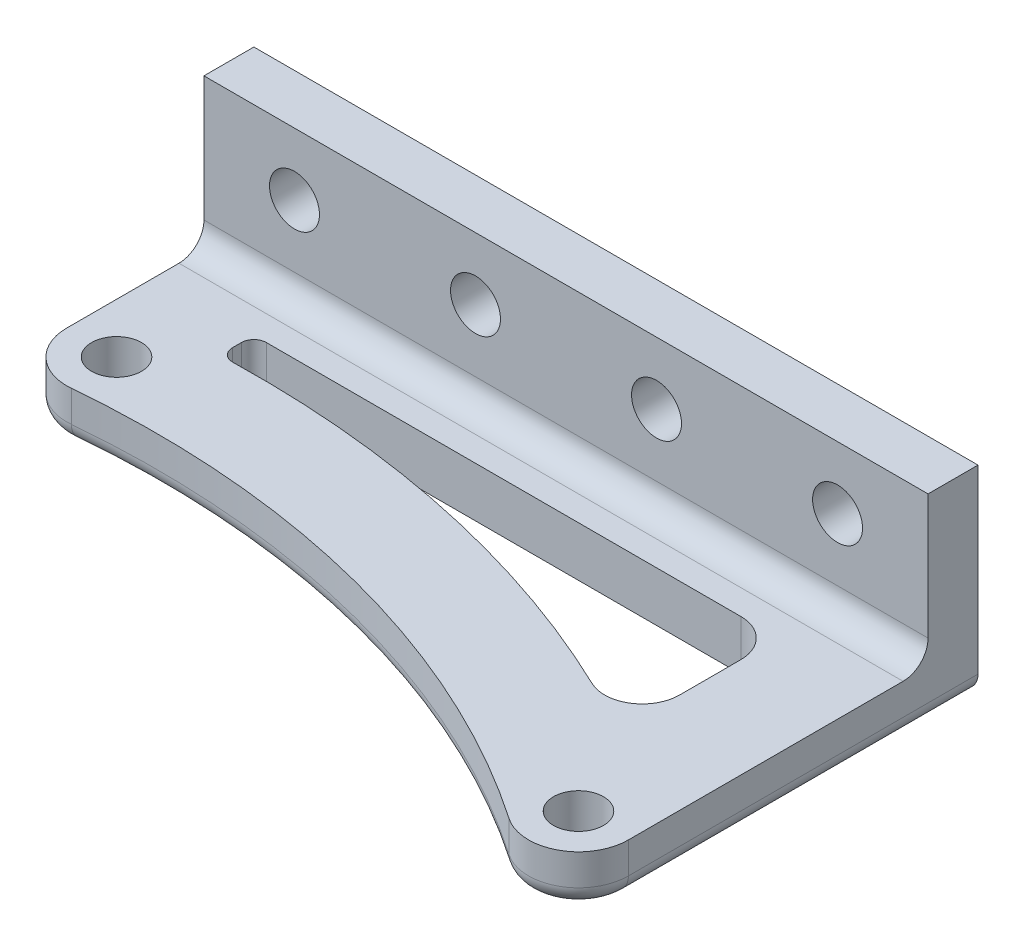
ISO-10303-21;
HEADER;
FILE_DESCRIPTION(('STEP AP214'),'2;1');
FILE_NAME('part.step','',(''),(''),'','','');
FILE_SCHEMA(('AUTOMOTIVE_DESIGN { 1 0 10303 214 1 1 1 1 }'));
ENDSEC;
DATA;
#1=APPLICATION_CONTEXT('core data for automotive mechanical design processes');
#2=APPLICATION_PROTOCOL_DEFINITION('international standard','automotive_design',2000,#1);
#3=PRODUCT_CONTEXT('',#1,'mechanical');
#4=PRODUCT('Part','Part','',(#3));
#5=PRODUCT_RELATED_PRODUCT_CATEGORY('part','',(#4));
#6=PRODUCT_DEFINITION_FORMATION('','',#4);
#7=PRODUCT_DEFINITION_CONTEXT('part definition',#1,'design');
#8=PRODUCT_DEFINITION('design','',#6,#7);
#9=PRODUCT_DEFINITION_SHAPE('','',#8);
#10=(LENGTH_UNIT() NAMED_UNIT(*) SI_UNIT(.MILLI.,.METRE.));
#11=(NAMED_UNIT(*) PLANE_ANGLE_UNIT() SI_UNIT($,.RADIAN.));
#12=(NAMED_UNIT(*) SI_UNIT($,.STERADIAN.) SOLID_ANGLE_UNIT());
#13=UNCERTAINTY_MEASURE_WITH_UNIT(LENGTH_MEASURE(1.E-05),#10,'distance_accuracy_value','');
#14=(GEOMETRIC_REPRESENTATION_CONTEXT(3) GLOBAL_UNCERTAINTY_ASSIGNED_CONTEXT((#13)) GLOBAL_UNIT_ASSIGNED_CONTEXT((#10,
#11,#12)) REPRESENTATION_CONTEXT('',''));
#15=CARTESIAN_POINT('',(0.,0.,0.));
#16=DIRECTION('',(0.,0.,1.));
#17=DIRECTION('',(1.,0.,0.));
#18=AXIS2_PLACEMENT_3D('',#15,#16,#17);
#19=CARTESIAN_POINT('',(-4.,4.,-28.));
#20=DIRECTION('',(0.,0.,1.));
#21=DIRECTION('',(1.,0.,0.));
#22=AXIS2_PLACEMENT_3D('',#19,#20,#21);
#23=PLANE('',#22);
#24=CARTESIAN_POINT('',(3.25,11.,-28.));
#25=DIRECTION('',(0.,0.,1.));
#26=DIRECTION('',(1.,0.,0.));
#27=AXIS2_PLACEMENT_3D('',#24,#25,#26);
#28=CIRCLE('',#27,2.);
#29=CARTESIAN_POINT('',(5.25,11.,-28.));
#30=VERTEX_POINT('',#29);
#31=EDGE_CURVE('E584',#30,#30,#28,.F.);
#32=ORIENTED_EDGE('',*,*,#31,.F.);
#33=EDGE_LOOP('',(#32));
#34=FACE_BOUND('',#33,.T.);
#35=CARTESIAN_POINT('',(17.75,11.,-28.));
#36=DIRECTION('',(0.,0.,1.));
#37=DIRECTION('',(1.,0.,0.));
#38=AXIS2_PLACEMENT_3D('',#35,#36,#37);
#39=CIRCLE('',#38,2.);
#40=CARTESIAN_POINT('',(19.75,11.,-28.));
#41=VERTEX_POINT('',#40);
#42=EDGE_CURVE('E203',#41,#41,#39,.F.);
#43=ORIENTED_EDGE('',*,*,#42,.F.);
#44=EDGE_LOOP('',(#43));
#45=FACE_BOUND('',#44,.T.);
#46=DIRECTION('',(0.,-1.,0.));
#47=VECTOR('',#46,1.);
#48=CARTESIAN_POINT('',(54.,4.,-28.));
#49=LINE('',#48,#47);
#50=CARTESIAN_POINT('',(54.,16.,-28.));
#51=VERTEX_POINT('',#50);
#52=CARTESIAN_POINT('',(54.,1.5,-28.));
#53=VERTEX_POINT('',#52);
#54=EDGE_CURVE('E185',#51,#53,#49,.T.);
#55=ORIENTED_EDGE('',*,*,#54,.T.);
#56=CARTESIAN_POINT('',(52.5,1.5,-28.));
#57=DIRECTION('',(0.,0.,1.));
#58=DIRECTION('',(1.,0.,0.));
#59=AXIS2_PLACEMENT_3D('',#56,#57,#58);
#60=CIRCLE('',#59,1.5);
#61=CARTESIAN_POINT('',(52.5,0.,-28.));
#62=VERTEX_POINT('',#61);
#63=EDGE_CURVE('E398',#53,#62,#60,.F.);
#64=ORIENTED_EDGE('',*,*,#63,.T.);
#65=DIRECTION('',(-1.,0.,0.));
#66=VECTOR('',#65,1.);
#67=CARTESIAN_POINT('',(-4.,0.,-28.));
#68=LINE('',#67,#66);
#69=CARTESIAN_POINT('',(-2.5,0.,-28.));
#70=VERTEX_POINT('',#69);
#71=EDGE_CURVE('E321',#62,#70,#68,.T.);
#72=ORIENTED_EDGE('',*,*,#71,.T.);
#73=CARTESIAN_POINT('',(-2.5,1.5,-28.));
#74=DIRECTION('',(0.,0.,1.));
#75=DIRECTION('',(1.,0.,0.));
#76=AXIS2_PLACEMENT_3D('',#73,#74,#75);
#77=CIRCLE('',#76,1.5);
#78=CARTESIAN_POINT('',(-4.,1.5,-28.));
#79=VERTEX_POINT('',#78);
#80=EDGE_CURVE('E182',#70,#79,#77,.F.);
#81=ORIENTED_EDGE('',*,*,#80,.T.);
#82=DIRECTION('',(0.,-1.,0.));
#83=VECTOR('',#82,1.);
#84=CARTESIAN_POINT('',(-4.,4.,-28.));
#85=LINE('',#84,#83);
#86=CARTESIAN_POINT('',(-4.,16.,-28.));
#87=VERTEX_POINT('',#86);
#88=EDGE_CURVE('E175',#87,#79,#85,.T.);
#89=ORIENTED_EDGE('',*,*,#88,.F.);
#90=DIRECTION('',(-1.,0.,0.));
#91=VECTOR('',#90,1.);
#92=CARTESIAN_POINT('',(54.,16.,-28.));
#93=LINE('',#92,#91);
#94=EDGE_CURVE('E180',#51,#87,#93,.T.);
#95=ORIENTED_EDGE('',*,*,#94,.F.);
#96=EDGE_LOOP('',(#55,#64,#72,#81,#89,#95));
#97=FACE_BOUND('',#96,.T.);
#98=CARTESIAN_POINT('',(32.25,11.,-28.));
#99=DIRECTION('',(0.,0.,1.));
#100=DIRECTION('',(1.,0.,0.));
#101=AXIS2_PLACEMENT_3D('',#98,#99,#100);
#102=CIRCLE('',#101,2.);
#103=CARTESIAN_POINT('',(34.25,11.,-28.));
#104=VERTEX_POINT('',#103);
#105=EDGE_CURVE('E564',#104,#104,#102,.T.);
#106=ORIENTED_EDGE('',*,*,#105,.T.);
#107=EDGE_LOOP('',(#106));
#108=FACE_BOUND('',#107,.T.);
#109=CARTESIAN_POINT('',(46.75,11.,-28.));
#110=DIRECTION('',(0.,0.,1.));
#111=DIRECTION('',(1.,0.,0.));
#112=AXIS2_PLACEMENT_3D('',#109,#110,#111);
#113=CIRCLE('',#112,2.);
#114=CARTESIAN_POINT('',(48.75,11.,-28.));
#115=VERTEX_POINT('',#114);
#116=EDGE_CURVE('E576',#115,#115,#113,.T.);
#117=ORIENTED_EDGE('',*,*,#116,.T.);
#118=EDGE_LOOP('',(#117));
#119=FACE_BOUND('',#118,.T.);
#120=ADVANCED_FACE('F38',(#34,#45,#97,#108,#119),#23,.F.);
#121=CARTESIAN_POINT('',(-4.,16.,-24.));
#122=DIRECTION('',(0.,0.,-1.));
#123=DIRECTION('',(-1.,0.,0.));
#124=AXIS2_PLACEMENT_3D('',#121,#122,#123);
#125=PLANE('',#124);
#126=CARTESIAN_POINT('',(3.25,11.,-24.));
#127=DIRECTION('',(0.,0.,1.));
#128=DIRECTION('',(1.,0.,0.));
#129=AXIS2_PLACEMENT_3D('',#126,#127,#128);
#130=CIRCLE('',#129,2.);
#131=CARTESIAN_POINT('',(5.25,11.,-24.));
#132=VERTEX_POINT('',#131);
#133=EDGE_CURVE('E580',#132,#132,#130,.T.);
#134=ORIENTED_EDGE('',*,*,#133,.F.);
#135=EDGE_LOOP('',(#134));
#136=FACE_BOUND('',#135,.T.);
#137=CARTESIAN_POINT('',(17.75,11.,-24.));
#138=DIRECTION('',(0.,0.,1.));
#139=DIRECTION('',(1.,0.,0.));
#140=AXIS2_PLACEMENT_3D('',#137,#138,#139);
#141=CIRCLE('',#140,2.);
#142=CARTESIAN_POINT('',(19.75,11.,-24.));
#143=VERTEX_POINT('',#142);
#144=EDGE_CURVE('E207',#143,#143,#141,.T.);
#145=ORIENTED_EDGE('',*,*,#144,.F.);
#146=EDGE_LOOP('',(#145));
#147=FACE_BOUND('',#146,.T.);
#148=DIRECTION('',(0.,-1.,0.));
#149=VECTOR('',#148,1.);
#150=CARTESIAN_POINT('',(-4.,16.,-24.));
#151=LINE('',#150,#149);
#152=CARTESIAN_POINT('',(-4.,16.,-24.));
#153=VERTEX_POINT('',#152);
#154=CARTESIAN_POINT('',(-4.,6.,-24.));
#155=VERTEX_POINT('',#154);
#156=EDGE_CURVE('E192',#153,#155,#151,.T.);
#157=ORIENTED_EDGE('',*,*,#156,.T.);
#158=DIRECTION('',(1.,0.,0.));
#159=VECTOR('',#158,1.);
#160=CARTESIAN_POINT('',(-4.,6.,-24.));
#161=LINE('',#160,#159);
#162=CARTESIAN_POINT('',(54.,6.,-24.));
#163=VERTEX_POINT('',#162);
#164=EDGE_CURVE('E358',#155,#163,#161,.T.);
#165=ORIENTED_EDGE('',*,*,#164,.T.);
#166=DIRECTION('',(0.,-1.,0.));
#167=VECTOR('',#166,1.);
#168=CARTESIAN_POINT('',(54.,16.,-24.));
#169=LINE('',#168,#167);
#170=CARTESIAN_POINT('',(54.,16.,-24.));
#171=VERTEX_POINT('',#170);
#172=EDGE_CURVE('E215',#171,#163,#169,.T.);
#173=ORIENTED_EDGE('',*,*,#172,.F.);
#174=DIRECTION('',(1.,0.,0.));
#175=VECTOR('',#174,1.);
#176=CARTESIAN_POINT('',(-4.,16.,-24.));
#177=LINE('',#176,#175);
#178=EDGE_CURVE('E196',#153,#171,#177,.T.);
#179=ORIENTED_EDGE('',*,*,#178,.F.);
#180=EDGE_LOOP('',(#157,#165,#173,#179));
#181=FACE_BOUND('',#180,.T.);
#182=CARTESIAN_POINT('',(32.25,11.,-24.));
#183=DIRECTION('',(0.,0.,1.));
#184=DIRECTION('',(1.,0.,0.));
#185=AXIS2_PLACEMENT_3D('',#182,#183,#184);
#186=CIRCLE('',#185,2.);
#187=CARTESIAN_POINT('',(34.25,11.,-24.));
#188=VERTEX_POINT('',#187);
#189=EDGE_CURVE('E567',#188,#188,#186,.F.);
#190=ORIENTED_EDGE('',*,*,#189,.T.);
#191=EDGE_LOOP('',(#190));
#192=FACE_BOUND('',#191,.T.);
#193=CARTESIAN_POINT('',(46.75,11.,-24.));
#194=DIRECTION('',(0.,0.,1.));
#195=DIRECTION('',(1.,0.,0.));
#196=AXIS2_PLACEMENT_3D('',#193,#194,#195);
#197=CIRCLE('',#196,2.);
#198=CARTESIAN_POINT('',(48.75,11.,-24.));
#199=VERTEX_POINT('',#198);
#200=EDGE_CURVE('E573',#199,#199,#197,.F.);
#201=ORIENTED_EDGE('',*,*,#200,.T.);
#202=EDGE_LOOP('',(#201));
#203=FACE_BOUND('',#202,.T.);
#204=ADVANCED_FACE('F458',(#136,#147,#181,#192,#203),#125,.F.);
#205=CARTESIAN_POINT('',(0.,1.5,-13.));
#206=DIRECTION('',(0.,1.,0.));
#207=DIRECTION('',(0.,0.,1.));
#208=AXIS2_PLACEMENT_3D('',#205,#206,#207);
#209=TOROIDAL_SURFACE('',#208,2.5,1.5);
#210=CARTESIAN_POINT('',(-2.5,1.5,-13.));
#211=DIRECTION('',(0.,0.,-1.));
#212=DIRECTION('',(-1.,0.,0.));
#213=AXIS2_PLACEMENT_3D('',#210,#211,#212);
#214=CIRCLE('',#213,1.5);
#215=CARTESIAN_POINT('',(-2.5,0.,-13.));
#216=VERTEX_POINT('',#215);
#217=CARTESIAN_POINT('',(-4.,1.5,-13.));
#218=VERTEX_POINT('',#217);
#219=EDGE_CURVE('E11',#216,#218,#214,.T.);
#220=ORIENTED_EDGE('',*,*,#219,.F.);
#221=CARTESIAN_POINT('',(0.,0.,-13.));
#222=DIRECTION('',(0.,1.,0.));
#223=DIRECTION('',(0.,0.,1.));
#224=AXIS2_PLACEMENT_3D('',#221,#222,#223);
#225=CIRCLE('',#224,2.5);
#226=CARTESIAN_POINT('',(0.225630994390622,0.,-10.5102026880948));
#227=VERTEX_POINT('',#226);
#228=EDGE_CURVE('E376',#227,#216,#225,.F.);
#229=ORIENTED_EDGE('',*,*,#228,.F.);
#230=CARTESIAN_POINT('',(0.225630994390629,1.5,-10.5102026880948));
#231=DIRECTION('',(-0.995918924762076,0.,0.090252397756244));
#232=DIRECTION('',(0.090252397756244,0.,0.995918924762076));
#233=AXIS2_PLACEMENT_3D('',#230,#231,#232);
#234=CIRCLE('',#233,1.5);
#235=CARTESIAN_POINT('',(0.361009591024995,1.5,-9.0163243009517));
#236=VERTEX_POINT('',#235);
#237=EDGE_CURVE('E47',#227,#236,#234,.T.);
#238=ORIENTED_EDGE('',*,*,#237,.T.);
#239=CARTESIAN_POINT('',(0.,1.5,-13.));
#240=DIRECTION('',(0.,1.,0.));
#241=DIRECTION('',(0.,0.,1.));
#242=AXIS2_PLACEMENT_3D('',#239,#240,#241);
#243=CIRCLE('',#242,4.);
#244=EDGE_CURVE('E409',#218,#236,#243,.T.);
#245=ORIENTED_EDGE('',*,*,#244,.F.);
#246=EDGE_LOOP('',(#220,#229,#238,#245));
#247=FACE_BOUND('',#246,.T.);
#248=ADVANCED_FACE('F447',(#247),#209,.T.);
#249=CARTESIAN_POINT('',(6.89832871152092,1.5,63.1218126479964));
#250=DIRECTION('',(0.,1.,0.));
#251=DIRECTION('',(0.,0.,1.));
#252=AXIS2_PLACEMENT_3D('',#249,#250,#251);
#253=TOROIDAL_SURFACE('',#252,73.9337445100583,1.5);
#254=ORIENTED_EDGE('',*,*,#237,.F.);
#255=CARTESIAN_POINT('',(6.89832871152092,0.,63.1218126479964));
#256=DIRECTION('',(0.,1.,0.));
#257=DIRECTION('',(0.,0.,1.));
#258=AXIS2_PLACEMENT_3D('',#255,#256,#257);
#259=CIRCLE('',#258,73.9337445100583);
#260=CARTESIAN_POINT('',(48.5902276682648,0.,2.06459244711248));
#261=VERTEX_POINT('',#260);
#262=EDGE_CURVE('E380',#261,#227,#259,.T.);
#263=ORIENTED_EDGE('',*,*,#262,.F.);
#264=CARTESIAN_POINT('',(48.5902276682648,1.5,2.06459244711248));
#265=DIRECTION('',(-0.825836978844991,0.,-0.563908932694082));
#266=DIRECTION('',(-0.563908932694082,0.,0.825836978844991));
#267=AXIS2_PLACEMENT_3D('',#264,#265,#266);
#268=CIRCLE('',#267,1.5);
#269=CARTESIAN_POINT('',(47.7443642692237,1.5,3.30334791537996));
#270=VERTEX_POINT('',#269);
#271=EDGE_CURVE('E418',#261,#270,#268,.T.);
#272=ORIENTED_EDGE('',*,*,#271,.T.);
#273=CARTESIAN_POINT('',(6.89832871152092,1.5,63.1218126479964));
#274=DIRECTION('',(0.,1.,0.));
#275=DIRECTION('',(0.,0.,1.));
#276=AXIS2_PLACEMENT_3D('',#273,#274,#275);
#277=CIRCLE('',#276,72.4337445100582);
#278=EDGE_CURVE('E405',#236,#270,#277,.F.);
#279=ORIENTED_EDGE('',*,*,#278,.F.);
#280=EDGE_LOOP('',(#254,#263,#272,#279));
#281=FACE_BOUND('',#280,.T.);
#282=ADVANCED_FACE('F424',(#281),#253,.T.);
#283=CARTESIAN_POINT('',(50.,1.5,0.));
#284=DIRECTION('',(0.,1.,0.));
#285=DIRECTION('',(0.,0.,1.));
#286=AXIS2_PLACEMENT_3D('',#283,#284,#285);
#287=TOROIDAL_SURFACE('',#286,2.50000000000001,1.5);
#288=ORIENTED_EDGE('',*,*,#271,.F.);
#289=CARTESIAN_POINT('',(50.,0.,0.));
#290=DIRECTION('',(0.,1.,0.));
#291=DIRECTION('',(0.,0.,1.));
#292=AXIS2_PLACEMENT_3D('',#289,#290,#291);
#293=CIRCLE('',#292,2.50000000000001);
#294=CARTESIAN_POINT('',(52.5,0.,0.));
#295=VERTEX_POINT('',#294);
#296=EDGE_CURVE('E384',#295,#261,#293,.F.);
#297=ORIENTED_EDGE('',*,*,#296,.F.);
#298=CARTESIAN_POINT('',(52.5,1.5,0.));
#299=DIRECTION('',(0.,0.,1.));
#300=DIRECTION('',(1.,0.,0.));
#301=AXIS2_PLACEMENT_3D('',#298,#299,#300);
#302=CIRCLE('',#301,1.5);
#303=CARTESIAN_POINT('',(54.,1.5,0.));
#304=VERTEX_POINT('',#303);
#305=EDGE_CURVE('E415',#295,#304,#302,.T.);
#306=ORIENTED_EDGE('',*,*,#305,.T.);
#307=CARTESIAN_POINT('',(50.,1.5,0.));
#308=DIRECTION('',(0.,1.,0.));
#309=DIRECTION('',(0.,0.,1.));
#310=AXIS2_PLACEMENT_3D('',#307,#308,#309);
#311=CIRCLE('',#310,4.00000000000001);
#312=EDGE_CURVE('E401',#270,#304,#311,.T.);
#313=ORIENTED_EDGE('',*,*,#312,.F.);
#314=EDGE_LOOP('',(#288,#297,#306,#313));
#315=FACE_BOUND('',#314,.T.);
#316=ADVANCED_FACE('F433',(#315),#287,.T.);
#317=CARTESIAN_POINT('',(52.5,1.5,-13.));
#318=DIRECTION('',(0.,0.,1.));
#319=DIRECTION('',(1.,0.,0.));
#320=AXIS2_PLACEMENT_3D('',#317,#318,#319);
#321=CYLINDRICAL_SURFACE('',#320,1.5);
#322=ORIENTED_EDGE('',*,*,#305,.F.);
#323=DIRECTION('',(0.,0.,1.));
#324=VECTOR('',#323,1.);
#325=CARTESIAN_POINT('',(52.5,0.,-13.));
#326=LINE('',#325,#324);
#327=EDGE_CURVE('E388',#62,#295,#326,.T.);
#328=ORIENTED_EDGE('',*,*,#327,.F.);
#329=ORIENTED_EDGE('',*,*,#63,.F.);
#330=DIRECTION('',(0.,0.,1.));
#331=VECTOR('',#330,1.);
#332=CARTESIAN_POINT('',(54.,1.5,-28.));
#333=LINE('',#332,#331);
#334=EDGE_CURVE('E392',#304,#53,#333,.F.);
#335=ORIENTED_EDGE('',*,*,#334,.F.);
#336=EDGE_LOOP('',(#322,#328,#329,#335));
#337=FACE_BOUND('',#336,.T.);
#338=ADVANCED_FACE('F464',(#337),#321,.T.);
#339=CARTESIAN_POINT('',(-2.5,1.5,-13.));
#340=DIRECTION('',(0.,0.,-1.));
#341=DIRECTION('',(-1.,0.,0.));
#342=AXIS2_PLACEMENT_3D('',#339,#340,#341);
#343=CYLINDRICAL_SURFACE('',#342,1.5);
#344=DIRECTION('',(0.,0.,-1.));
#345=VECTOR('',#344,1.);
#346=CARTESIAN_POINT('',(-2.5,0.,-13.));
#347=LINE('',#346,#345);
#348=EDGE_CURVE('E372',#216,#70,#347,.T.);
#349=ORIENTED_EDGE('',*,*,#348,.F.);
#350=ORIENTED_EDGE('',*,*,#219,.T.);
#351=DIRECTION('',(0.,0.,-1.));
#352=VECTOR('',#351,1.);
#353=CARTESIAN_POINT('',(-4.,1.5,-13.));
#354=LINE('',#353,#352);
#355=EDGE_CURVE('E412',#79,#218,#354,.F.);
#356=ORIENTED_EDGE('',*,*,#355,.F.);
#357=ORIENTED_EDGE('',*,*,#80,.F.);
#358=EDGE_LOOP('',(#349,#350,#356,#357));
#359=FACE_BOUND('',#358,.T.);
#360=ADVANCED_FACE('F40',(#359),#343,.T.);
#361=CARTESIAN_POINT('',(-4.,6.,-22.));
#362=DIRECTION('',(1.,0.,0.));
#363=DIRECTION('',(0.,0.,-1.));
#364=AXIS2_PLACEMENT_3D('',#361,#362,#363);
#365=CYLINDRICAL_SURFACE('',#364,2.);
#366=ORIENTED_EDGE('',*,*,#164,.F.);
#367=CARTESIAN_POINT('',(-4.,6.,-22.));
#368=DIRECTION('',(1.,0.,0.));
#369=DIRECTION('',(0.,0.,-1.));
#370=AXIS2_PLACEMENT_3D('',#367,#368,#369);
#371=CIRCLE('',#370,2.);
#372=CARTESIAN_POINT('',(-4.,4.,-22.));
#373=VERTEX_POINT('',#372);
#374=EDGE_CURVE('E366',#155,#373,#371,.F.);
#375=ORIENTED_EDGE('',*,*,#374,.T.);
#376=DIRECTION('',(1.,0.,0.));
#377=VECTOR('',#376,1.);
#378=CARTESIAN_POINT('',(0.,4.,-22.));
#379=LINE('',#378,#377);
#380=CARTESIAN_POINT('',(54.,4.,-22.));
#381=VERTEX_POINT('',#380);
#382=EDGE_CURVE('E362',#381,#373,#379,.F.);
#383=ORIENTED_EDGE('',*,*,#382,.F.);
#384=CARTESIAN_POINT('',(54.,6.,-22.));
#385=DIRECTION('',(-1.,0.,0.));
#386=DIRECTION('',(0.,0.,1.));
#387=AXIS2_PLACEMENT_3D('',#384,#385,#386);
#388=CIRCLE('',#387,2.);
#389=EDGE_CURVE('E369',#381,#163,#388,.F.);
#390=ORIENTED_EDGE('',*,*,#389,.T.);
#391=EDGE_LOOP('',(#366,#375,#383,#390));
#392=FACE_BOUND('',#391,.T.);
#393=ADVANCED_FACE('F455',(#392),#365,.F.);
#394=CARTESIAN_POINT('',(0.,4.,-13.));
#395=DIRECTION('',(0.,1.,0.));
#396=DIRECTION('',(0.,0.,1.));
#397=AXIS2_PLACEMENT_3D('',#394,#395,#396);
#398=PLANE('',#397);
#399=DIRECTION('',(0.,0.,-1.));
#400=VECTOR('',#399,1.);
#401=CARTESIAN_POINT('',(54.,4.,-28.));
#402=LINE('',#401,#400);
#403=CARTESIAN_POINT('',(54.,4.,0.));
#404=VERTEX_POINT('',#403);
#405=EDGE_CURVE('E332',#404,#381,#402,.T.);
#406=ORIENTED_EDGE('',*,*,#405,.T.);
#407=ORIENTED_EDGE('',*,*,#382,.T.);
#408=DIRECTION('',(0.,0.,1.));
#409=VECTOR('',#408,1.);
#410=CARTESIAN_POINT('',(-4.,4.,-13.));
#411=LINE('',#410,#409);
#412=CARTESIAN_POINT('',(-4.,4.,-13.));
#413=VERTEX_POINT('',#412);
#414=EDGE_CURVE('E336',#373,#413,#411,.T.);
#415=ORIENTED_EDGE('',*,*,#414,.T.);
#416=CARTESIAN_POINT('',(0.,4.,-13.));
#417=DIRECTION('',(0.,1.,0.));
#418=DIRECTION('',(0.,0.,1.));
#419=AXIS2_PLACEMENT_3D('',#416,#417,#418);
#420=CIRCLE('',#419,4.);
#421=CARTESIAN_POINT('',(0.361009591024995,4.,-9.0163243009517));
#422=VERTEX_POINT('',#421);
#423=EDGE_CURVE('E322',#413,#422,#420,.T.);
#424=ORIENTED_EDGE('',*,*,#423,.T.);
#425=CARTESIAN_POINT('',(6.89832871152092,4.,63.1218126479964));
#426=DIRECTION('',(0.,-1.,0.));
#427=DIRECTION('',(0.,0.,1.));
#428=AXIS2_PLACEMENT_3D('',#425,#426,#427);
#429=CIRCLE('',#428,72.4337445100582);
#430=CARTESIAN_POINT('',(47.7443642692237,4.,3.30334791537996));
#431=VERTEX_POINT('',#430);
#432=EDGE_CURVE('E326',#422,#431,#429,.T.);
#433=ORIENTED_EDGE('',*,*,#432,.T.);
#434=CARTESIAN_POINT('',(50.,4.,0.));
#435=DIRECTION('',(0.,1.,0.));
#436=DIRECTION('',(0.,0.,1.));
#437=AXIS2_PLACEMENT_3D('',#434,#435,#436);
#438=CIRCLE('',#437,4.00000000000001);
#439=EDGE_CURVE('E329',#431,#404,#438,.T.);
#440=ORIENTED_EDGE('',*,*,#439,.T.);
#441=EDGE_LOOP('',(#406,#407,#415,#424,#433,#440));
#442=FACE_BOUND('',#441,.T.);
#443=CARTESIAN_POINT('',(0.,4.,-13.));
#444=DIRECTION('',(0.,1.,0.));
#445=DIRECTION('',(0.,0.,1.));
#446=AXIS2_PLACEMENT_3D('',#443,#444,#445);
#447=CIRCLE('',#446,2.);
#448=CARTESIAN_POINT('',(0.,4.,-11.));
#449=VERTEX_POINT('',#448);
#450=EDGE_CURVE('E230',#449,#449,#447,.T.);
#451=ORIENTED_EDGE('',*,*,#450,.F.);
#452=EDGE_LOOP('',(#451));
#453=FACE_BOUND('',#452,.T.);
#454=CARTESIAN_POINT('',(43.,4.,-12.0969287210818));
#455=DIRECTION('',(0.,1.,0.));
#456=DIRECTION('',(0.,0.,-1.));
#457=AXIS2_PLACEMENT_3D('',#454,#455,#456);
#458=CIRCLE('',#457,3.00000000000001);
#459=CARTESIAN_POINT('',(41.7019039538327,4.,-9.3923129156623));
#460=VERTEX_POINT('',#459);
#461=CARTESIAN_POINT('',(46.,4.,-12.0969287210818));
#462=VERTEX_POINT('',#461);
#463=EDGE_CURVE('E241',#460,#462,#458,.T.);
#464=ORIENTED_EDGE('',*,*,#463,.F.);
#465=CARTESIAN_POINT('',(6.89832871152092,4.,63.1218126479964));
#466=DIRECTION('',(0.,-1.,0.));
#467=DIRECTION('',(0.,0.,1.));
#468=AXIS2_PLACEMENT_3D('',#465,#466,#467);
#469=CIRCLE('',#468,80.4337445100582);
#470=CARTESIAN_POINT('',(5.02331132779098,4.,-17.2900743197898));
#471=VERTEX_POINT('',#470);
#472=EDGE_CURVE('E238',#471,#460,#469,.T.);
#473=ORIENTED_EDGE('',*,*,#472,.F.);
#474=CARTESIAN_POINT('',(5.,4.,-18.2898025738652));
#475=DIRECTION('',(0.,1.,0.));
#476=DIRECTION('',(0.,0.,-1.));
#477=AXIS2_PLACEMENT_3D('',#474,#475,#476);
#478=CIRCLE('',#477,1.);
#479=CARTESIAN_POINT('',(4.,4.,-18.2898025738652));
#480=VERTEX_POINT('',#479);
#481=EDGE_CURVE('E261',#480,#471,#478,.T.);
#482=ORIENTED_EDGE('',*,*,#481,.F.);
#483=DIRECTION('',(0.,0.,1.));
#484=VECTOR('',#483,1.);
#485=CARTESIAN_POINT('',(4.,4.,-18.2898025738652));
#486=LINE('',#485,#484);
#487=CARTESIAN_POINT('',(4.,4.,-19.));
#488=VERTEX_POINT('',#487);
#489=EDGE_CURVE('E257',#488,#480,#486,.T.);
#490=ORIENTED_EDGE('',*,*,#489,.F.);
#491=CARTESIAN_POINT('',(5.,4.,-19.));
#492=DIRECTION('',(0.,1.,0.));
#493=DIRECTION('',(0.,0.,1.));
#494=AXIS2_PLACEMENT_3D('',#491,#492,#493);
#495=CIRCLE('',#494,1.);
#496=CARTESIAN_POINT('',(5.00000000000001,4.,-20.));
#497=VERTEX_POINT('',#496);
#498=EDGE_CURVE('E254',#497,#488,#495,.T.);
#499=ORIENTED_EDGE('',*,*,#498,.F.);
#500=DIRECTION('',(-1.,0.,0.));
#501=VECTOR('',#500,1.);
#502=CARTESIAN_POINT('',(25.,4.,-20.));
#503=LINE('',#502,#501);
#504=CARTESIAN_POINT('',(43.,4.,-20.));
#505=VERTEX_POINT('',#504);
#506=EDGE_CURVE('E251',#505,#497,#503,.T.);
#507=ORIENTED_EDGE('',*,*,#506,.F.);
#508=CARTESIAN_POINT('',(43.,4.,-17.));
#509=DIRECTION('',(0.,1.,0.));
#510=DIRECTION('',(0.,0.,1.));
#511=AXIS2_PLACEMENT_3D('',#508,#509,#510);
#512=CIRCLE('',#511,3.);
#513=CARTESIAN_POINT('',(46.,4.,-17.));
#514=VERTEX_POINT('',#513);
#515=EDGE_CURVE('E248',#514,#505,#512,.T.);
#516=ORIENTED_EDGE('',*,*,#515,.F.);
#517=DIRECTION('',(0.,0.,-1.));
#518=VECTOR('',#517,1.);
#519=CARTESIAN_POINT('',(46.,4.,-12.0969287210818));
#520=LINE('',#519,#518);
#521=EDGE_CURVE('E245',#462,#514,#520,.T.);
#522=ORIENTED_EDGE('',*,*,#521,.F.);
#523=EDGE_LOOP('',(#464,#473,#482,#490,#499,#507,#516,#522));
#524=FACE_BOUND('',#523,.T.);
#525=CARTESIAN_POINT('',(50.,4.,0.));
#526=DIRECTION('',(0.,1.,0.));
#527=DIRECTION('',(0.,0.,1.));
#528=AXIS2_PLACEMENT_3D('',#525,#526,#527);
#529=CIRCLE('',#528,2.);
#530=CARTESIAN_POINT('',(50.,4.,2.));
#531=VERTEX_POINT('',#530);
#532=EDGE_CURVE('E222',#531,#531,#529,.T.);
#533=ORIENTED_EDGE('',*,*,#532,.F.);
#534=EDGE_LOOP('',(#533));
#535=FACE_BOUND('',#534,.T.);
#536=ADVANCED_FACE('F440',(#442,#453,#524,#535),#398,.T.);
#537=CARTESIAN_POINT('',(0.,0.,-13.));
#538=DIRECTION('',(0.,1.,0.));
#539=DIRECTION('',(0.,0.,1.));
#540=AXIS2_PLACEMENT_3D('',#537,#538,#539);
#541=PLANE('',#540);
#542=ORIENTED_EDGE('',*,*,#71,.F.);
#543=ORIENTED_EDGE('',*,*,#327,.T.);
#544=ORIENTED_EDGE('',*,*,#296,.T.);
#545=ORIENTED_EDGE('',*,*,#262,.T.);
#546=ORIENTED_EDGE('',*,*,#228,.T.);
#547=ORIENTED_EDGE('',*,*,#348,.T.);
#548=EDGE_LOOP('',(#542,#543,#544,#545,#546,#547));
#549=FACE_BOUND('',#548,.T.);
#550=CARTESIAN_POINT('',(6.89832871152092,0.,63.1218126479964));
#551=DIRECTION('',(0.,-1.,0.));
#552=DIRECTION('',(0.,0.,1.));
#553=AXIS2_PLACEMENT_3D('',#550,#551,#552);
#554=CIRCLE('',#553,80.4337445100582);
#555=CARTESIAN_POINT('',(5.02331132779098,0.,-17.2900743197898));
#556=VERTEX_POINT('',#555);
#557=CARTESIAN_POINT('',(41.7019039538327,0.,-9.3923129156623));
#558=VERTEX_POINT('',#557);
#559=EDGE_CURVE('E234',#556,#558,#554,.T.);
#560=ORIENTED_EDGE('',*,*,#559,.T.);
#561=CARTESIAN_POINT('',(43.,0.,-12.0969287210818));
#562=DIRECTION('',(0.,1.,0.));
#563=DIRECTION('',(0.,0.,-1.));
#564=AXIS2_PLACEMENT_3D('',#561,#562,#563);
#565=CIRCLE('',#564,3.00000000000001);
#566=CARTESIAN_POINT('',(46.,0.,-12.0969287210818));
#567=VERTEX_POINT('',#566);
#568=EDGE_CURVE('E268',#558,#567,#565,.T.);
#569=ORIENTED_EDGE('',*,*,#568,.T.);
#570=DIRECTION('',(0.,0.,-1.));
#571=VECTOR('',#570,1.);
#572=CARTESIAN_POINT('',(46.,0.,-12.0969287210818));
#573=LINE('',#572,#571);
#574=CARTESIAN_POINT('',(46.,0.,-17.));
#575=VERTEX_POINT('',#574);
#576=EDGE_CURVE('E272',#567,#575,#573,.T.);
#577=ORIENTED_EDGE('',*,*,#576,.T.);
#578=CARTESIAN_POINT('',(43.,0.,-17.));
#579=DIRECTION('',(0.,1.,0.));
#580=DIRECTION('',(0.,0.,1.));
#581=AXIS2_PLACEMENT_3D('',#578,#579,#580);
#582=CIRCLE('',#581,3.);
#583=CARTESIAN_POINT('',(43.,0.,-20.));
#584=VERTEX_POINT('',#583);
#585=EDGE_CURVE('E276',#575,#584,#582,.T.);
#586=ORIENTED_EDGE('',*,*,#585,.T.);
#587=DIRECTION('',(-1.,0.,0.));
#588=VECTOR('',#587,1.);
#589=CARTESIAN_POINT('',(25.,0.,-20.));
#590=LINE('',#589,#588);
#591=CARTESIAN_POINT('',(5.00000000000001,0.,-20.));
#592=VERTEX_POINT('',#591);
#593=EDGE_CURVE('E280',#584,#592,#590,.T.);
#594=ORIENTED_EDGE('',*,*,#593,.T.);
#595=CARTESIAN_POINT('',(5.,0.,-19.));
#596=DIRECTION('',(0.,1.,0.));
#597=DIRECTION('',(0.,0.,1.));
#598=AXIS2_PLACEMENT_3D('',#595,#596,#597);
#599=CIRCLE('',#598,1.);
#600=CARTESIAN_POINT('',(4.,0.,-19.));
#601=VERTEX_POINT('',#600);
#602=EDGE_CURVE('E284',#592,#601,#599,.T.);
#603=ORIENTED_EDGE('',*,*,#602,.T.);
#604=DIRECTION('',(0.,0.,1.));
#605=VECTOR('',#604,1.);
#606=CARTESIAN_POINT('',(4.,0.,-18.2898025738652));
#607=LINE('',#606,#605);
#608=CARTESIAN_POINT('',(4.,0.,-18.2898025738652));
#609=VERTEX_POINT('',#608);
#610=EDGE_CURVE('E288',#601,#609,#607,.T.);
#611=ORIENTED_EDGE('',*,*,#610,.T.);
#612=CARTESIAN_POINT('',(5.,0.,-18.2898025738652));
#613=DIRECTION('',(0.,1.,0.));
#614=DIRECTION('',(0.,0.,-1.));
#615=AXIS2_PLACEMENT_3D('',#612,#613,#614);
#616=CIRCLE('',#615,1.);
#617=EDGE_CURVE('E242',#609,#556,#616,.T.);
#618=ORIENTED_EDGE('',*,*,#617,.T.);
#619=EDGE_LOOP('',(#560,#569,#577,#586,#594,#603,#611,#618));
#620=FACE_BOUND('',#619,.T.);
#621=CARTESIAN_POINT('',(0.,0.,-13.));
#622=DIRECTION('',(0.,1.,0.));
#623=DIRECTION('',(0.,0.,1.));
#624=AXIS2_PLACEMENT_3D('',#621,#622,#623);
#625=CIRCLE('',#624,2.);
#626=CARTESIAN_POINT('',(0.,0.,-11.));
#627=VERTEX_POINT('',#626);
#628=EDGE_CURVE('E226',#627,#627,#625,.T.);
#629=ORIENTED_EDGE('',*,*,#628,.T.);
#630=EDGE_LOOP('',(#629));
#631=FACE_BOUND('',#630,.T.);
#632=CARTESIAN_POINT('',(50.,0.,0.));
#633=DIRECTION('',(0.,1.,0.));
#634=DIRECTION('',(0.,0.,1.));
#635=AXIS2_PLACEMENT_3D('',#632,#633,#634);
#636=CIRCLE('',#635,2.);
#637=CARTESIAN_POINT('',(50.,0.,2.));
#638=VERTEX_POINT('',#637);
#639=EDGE_CURVE('E221',#638,#638,#636,.T.);
#640=ORIENTED_EDGE('',*,*,#639,.T.);
#641=EDGE_LOOP('',(#640));
#642=FACE_BOUND('',#641,.T.);
#643=ADVANCED_FACE('F450',(#549,#620,#631,#642),#541,.F.);
#644=CARTESIAN_POINT('',(0.,4.,-13.));
#645=DIRECTION('',(0.,-1.,0.));
#646=DIRECTION('',(0.,0.,-1.));
#647=AXIS2_PLACEMENT_3D('',#644,#645,#646);
#648=CYLINDRICAL_SURFACE('',#647,4.);
#649=DIRECTION('',(0.,-1.,0.));
#650=VECTOR('',#649,1.);
#651=CARTESIAN_POINT('',(-4.,4.,-13.));
#652=LINE('',#651,#650);
#653=EDGE_CURVE('E186',#413,#218,#652,.T.);
#654=ORIENTED_EDGE('',*,*,#653,.T.);
#655=ORIENTED_EDGE('',*,*,#244,.T.);
#656=DIRECTION('',(0.,-1.,0.));
#657=VECTOR('',#656,1.);
#658=CARTESIAN_POINT('',(0.361009591024995,4.,-9.0163243009517));
#659=LINE('',#658,#657);
#660=EDGE_CURVE('E354',#422,#236,#659,.T.);
#661=ORIENTED_EDGE('',*,*,#660,.F.);
#662=ORIENTED_EDGE('',*,*,#423,.F.);
#663=EDGE_LOOP('',(#654,#655,#661,#662));
#664=FACE_BOUND('',#663,.T.);
#665=ADVANCED_FACE('F446',(#664),#648,.T.);
#666=CARTESIAN_POINT('',(6.89832871152092,4.,63.1218126479964));
#667=DIRECTION('',(0.,-1.,0.));
#668=DIRECTION('',(0.,0.,-1.));
#669=AXIS2_PLACEMENT_3D('',#666,#667,#668);
#670=CYLINDRICAL_SURFACE('',#669,72.4337445100582);
#671=ORIENTED_EDGE('',*,*,#660,.T.);
#672=ORIENTED_EDGE('',*,*,#278,.T.);
#673=DIRECTION('',(0.,-1.,0.));
#674=VECTOR('',#673,1.);
#675=CARTESIAN_POINT('',(47.7443642692237,4.,3.30334791537996));
#676=LINE('',#675,#674);
#677=EDGE_CURVE('E350',#431,#270,#676,.T.);
#678=ORIENTED_EDGE('',*,*,#677,.F.);
#679=ORIENTED_EDGE('',*,*,#432,.F.);
#680=EDGE_LOOP('',(#671,#672,#678,#679));
#681=FACE_BOUND('',#680,.T.);
#682=ADVANCED_FACE('F430',(#681),#670,.F.);
#683=CARTESIAN_POINT('',(50.,4.,0.));
#684=DIRECTION('',(0.,-1.,0.));
#685=DIRECTION('',(0.,0.,-1.));
#686=AXIS2_PLACEMENT_3D('',#683,#684,#685);
#687=CYLINDRICAL_SURFACE('',#686,4.00000000000001);
#688=ORIENTED_EDGE('',*,*,#677,.T.);
#689=ORIENTED_EDGE('',*,*,#312,.T.);
#690=DIRECTION('',(0.,-1.,0.));
#691=VECTOR('',#690,1.);
#692=CARTESIAN_POINT('',(54.,4.,0.));
#693=LINE('',#692,#691);
#694=EDGE_CURVE('E346',#404,#304,#693,.T.);
#695=ORIENTED_EDGE('',*,*,#694,.F.);
#696=ORIENTED_EDGE('',*,*,#439,.F.);
#697=EDGE_LOOP('',(#688,#689,#695,#696));
#698=FACE_BOUND('',#697,.T.);
#699=ADVANCED_FACE('F437',(#698),#687,.T.);
#700=CARTESIAN_POINT('',(54.,4.,-28.));
#701=DIRECTION('',(-1.,0.,0.));
#702=DIRECTION('',(0.,0.,1.));
#703=AXIS2_PLACEMENT_3D('',#700,#701,#702);
#704=PLANE('',#703);
#705=ORIENTED_EDGE('',*,*,#694,.T.);
#706=ORIENTED_EDGE('',*,*,#334,.T.);
#707=ORIENTED_EDGE('',*,*,#54,.F.);
#708=DIRECTION('',(0.,0.,-1.));
#709=VECTOR('',#708,1.);
#710=CARTESIAN_POINT('',(54.,16.,-24.));
#711=LINE('',#710,#709);
#712=EDGE_CURVE('E201',#171,#51,#711,.T.);
#713=ORIENTED_EDGE('',*,*,#712,.F.);
#714=ORIENTED_EDGE('',*,*,#172,.T.);
#715=ORIENTED_EDGE('',*,*,#389,.F.);
#716=ORIENTED_EDGE('',*,*,#405,.F.);
#717=EDGE_LOOP('',(#705,#706,#707,#713,#714,#715,#716));
#718=FACE_BOUND('',#717,.T.);
#719=ADVANCED_FACE('F461',(#718),#704,.F.);
#720=CARTESIAN_POINT('',(-4.,4.,-13.));
#721=DIRECTION('',(1.,0.,0.));
#722=DIRECTION('',(0.,0.,-1.));
#723=AXIS2_PLACEMENT_3D('',#720,#721,#722);
#724=PLANE('',#723);
#725=ORIENTED_EDGE('',*,*,#88,.T.);
#726=ORIENTED_EDGE('',*,*,#355,.T.);
#727=ORIENTED_EDGE('',*,*,#653,.F.);
#728=ORIENTED_EDGE('',*,*,#414,.F.);
#729=ORIENTED_EDGE('',*,*,#374,.F.);
#730=ORIENTED_EDGE('',*,*,#156,.F.);
#731=DIRECTION('',(0.,0.,1.));
#732=VECTOR('',#731,1.);
#733=CARTESIAN_POINT('',(-4.,16.,-28.));
#734=LINE('',#733,#732);
#735=EDGE_CURVE('E189',#87,#153,#734,.T.);
#736=ORIENTED_EDGE('',*,*,#735,.F.);
#737=EDGE_LOOP('',(#725,#726,#727,#728,#729,#730,#736));
#738=FACE_BOUND('',#737,.T.);
#739=ADVANCED_FACE('F190',(#738),#724,.F.);
#740=CARTESIAN_POINT('',(6.89832871152092,4.,63.1218126479964));
#741=DIRECTION('',(0.,-1.,0.));
#742=DIRECTION('',(0.,0.,-1.));
#743=AXIS2_PLACEMENT_3D('',#740,#741,#742);
#744=CYLINDRICAL_SURFACE('',#743,80.4337445100582);
#745=ORIENTED_EDGE('',*,*,#559,.F.);
#746=DIRECTION('',(0.,-1.,0.));
#747=VECTOR('',#746,1.);
#748=CARTESIAN_POINT('',(5.02331132779098,4.,-17.2900743197898));
#749=LINE('',#748,#747);
#750=EDGE_CURVE('E264',#471,#556,#749,.T.);
#751=ORIENTED_EDGE('',*,*,#750,.F.);
#752=ORIENTED_EDGE('',*,*,#472,.T.);
#753=DIRECTION('',(0.,-1.,0.));
#754=VECTOR('',#753,1.);
#755=CARTESIAN_POINT('',(41.7019039538327,4.,-9.3923129156623));
#756=LINE('',#755,#754);
#757=EDGE_CURVE('E317',#460,#558,#756,.T.);
#758=ORIENTED_EDGE('',*,*,#757,.T.);
#759=EDGE_LOOP('',(#745,#751,#752,#758));
#760=FACE_BOUND('',#759,.T.);
#761=ADVANCED_FACE('F502',(#760),#744,.T.);
#762=CARTESIAN_POINT('',(43.,4.,-12.0969287210818));
#763=DIRECTION('',(0.,-1.,0.));
#764=DIRECTION('',(0.,0.,-1.));
#765=AXIS2_PLACEMENT_3D('',#762,#763,#764);
#766=CYLINDRICAL_SURFACE('',#765,3.00000000000001);
#767=ORIENTED_EDGE('',*,*,#568,.F.);
#768=ORIENTED_EDGE('',*,*,#757,.F.);
#769=ORIENTED_EDGE('',*,*,#463,.T.);
#770=DIRECTION('',(0.,-1.,0.));
#771=VECTOR('',#770,1.);
#772=CARTESIAN_POINT('',(46.,4.,-12.0969287210818));
#773=LINE('',#772,#771);
#774=EDGE_CURVE('E314',#462,#567,#773,.T.);
#775=ORIENTED_EDGE('',*,*,#774,.T.);
#776=EDGE_LOOP('',(#767,#768,#769,#775));
#777=FACE_BOUND('',#776,.T.);
#778=ADVANCED_FACE('F505',(#777),#766,.F.);
#779=CARTESIAN_POINT('',(46.,4.,-12.0969287210818));
#780=DIRECTION('',(-1.,0.,0.));
#781=DIRECTION('',(0.,0.,1.));
#782=AXIS2_PLACEMENT_3D('',#779,#780,#781);
#783=PLANE('',#782);
#784=ORIENTED_EDGE('',*,*,#576,.F.);
#785=ORIENTED_EDGE('',*,*,#774,.F.);
#786=ORIENTED_EDGE('',*,*,#521,.T.);
#787=DIRECTION('',(0.,-1.,0.));
#788=VECTOR('',#787,1.);
#789=CARTESIAN_POINT('',(46.,4.,-17.));
#790=LINE('',#789,#788);
#791=EDGE_CURVE('E311',#514,#575,#790,.T.);
#792=ORIENTED_EDGE('',*,*,#791,.T.);
#793=EDGE_LOOP('',(#784,#785,#786,#792));
#794=FACE_BOUND('',#793,.T.);
#795=ADVANCED_FACE('F509',(#794),#783,.T.);
#796=CARTESIAN_POINT('',(43.,4.,-17.));
#797=DIRECTION('',(0.,-1.,0.));
#798=DIRECTION('',(0.,0.,-1.));
#799=AXIS2_PLACEMENT_3D('',#796,#797,#798);
#800=CYLINDRICAL_SURFACE('',#799,3.);
#801=ORIENTED_EDGE('',*,*,#585,.F.);
#802=ORIENTED_EDGE('',*,*,#791,.F.);
#803=ORIENTED_EDGE('',*,*,#515,.T.);
#804=DIRECTION('',(0.,-1.,0.));
#805=VECTOR('',#804,1.);
#806=CARTESIAN_POINT('',(43.,4.,-20.));
#807=LINE('',#806,#805);
#808=EDGE_CURVE('E307',#505,#584,#807,.T.);
#809=ORIENTED_EDGE('',*,*,#808,.T.);
#810=EDGE_LOOP('',(#801,#802,#803,#809));
#811=FACE_BOUND('',#810,.T.);
#812=ADVANCED_FACE('F513',(#811),#800,.F.);
#813=CARTESIAN_POINT('',(25.,4.,-20.));
#814=DIRECTION('',(0.,0.,1.));
#815=DIRECTION('',(1.,0.,0.));
#816=AXIS2_PLACEMENT_3D('',#813,#814,#815);
#817=PLANE('',#816);
#818=ORIENTED_EDGE('',*,*,#593,.F.);
#819=ORIENTED_EDGE('',*,*,#808,.F.);
#820=ORIENTED_EDGE('',*,*,#506,.T.);
#821=DIRECTION('',(0.,-1.,0.));
#822=VECTOR('',#821,1.);
#823=CARTESIAN_POINT('',(5.00000000000001,4.,-20.));
#824=LINE('',#823,#822);
#825=EDGE_CURVE('E304',#497,#592,#824,.T.);
#826=ORIENTED_EDGE('',*,*,#825,.T.);
#827=EDGE_LOOP('',(#818,#819,#820,#826));
#828=FACE_BOUND('',#827,.T.);
#829=ADVANCED_FACE('F517',(#828),#817,.T.);
#830=CARTESIAN_POINT('',(5.,4.,-19.));
#831=DIRECTION('',(0.,-1.,0.));
#832=DIRECTION('',(0.,0.,-1.));
#833=AXIS2_PLACEMENT_3D('',#830,#831,#832);
#834=CYLINDRICAL_SURFACE('',#833,1.);
#835=ORIENTED_EDGE('',*,*,#602,.F.);
#836=ORIENTED_EDGE('',*,*,#825,.F.);
#837=ORIENTED_EDGE('',*,*,#498,.T.);
#838=DIRECTION('',(0.,-1.,0.));
#839=VECTOR('',#838,1.);
#840=CARTESIAN_POINT('',(4.,4.,-19.));
#841=LINE('',#840,#839);
#842=EDGE_CURVE('E301',#488,#601,#841,.T.);
#843=ORIENTED_EDGE('',*,*,#842,.T.);
#844=EDGE_LOOP('',(#835,#836,#837,#843));
#845=FACE_BOUND('',#844,.T.);
#846=ADVANCED_FACE('F521',(#845),#834,.F.);
#847=CARTESIAN_POINT('',(4.,4.,-18.2898025738652));
#848=DIRECTION('',(1.,0.,0.));
#849=DIRECTION('',(0.,0.,-1.));
#850=AXIS2_PLACEMENT_3D('',#847,#848,#849);
#851=PLANE('',#850);
#852=ORIENTED_EDGE('',*,*,#610,.F.);
#853=ORIENTED_EDGE('',*,*,#842,.F.);
#854=ORIENTED_EDGE('',*,*,#489,.T.);
#855=DIRECTION('',(0.,-1.,0.));
#856=VECTOR('',#855,1.);
#857=CARTESIAN_POINT('',(4.,4.,-18.2898025738652));
#858=LINE('',#857,#856);
#859=EDGE_CURVE('E298',#480,#609,#858,.T.);
#860=ORIENTED_EDGE('',*,*,#859,.T.);
#861=EDGE_LOOP('',(#852,#853,#854,#860));
#862=FACE_BOUND('',#861,.T.);
#863=ADVANCED_FACE('F525',(#862),#851,.T.);
#864=CARTESIAN_POINT('',(5.,4.,-18.2898025738652));
#865=DIRECTION('',(0.,-1.,0.));
#866=DIRECTION('',(0.,0.,-1.));
#867=AXIS2_PLACEMENT_3D('',#864,#865,#866);
#868=CYLINDRICAL_SURFACE('',#867,1.);
#869=ORIENTED_EDGE('',*,*,#617,.F.);
#870=ORIENTED_EDGE('',*,*,#859,.F.);
#871=ORIENTED_EDGE('',*,*,#481,.T.);
#872=ORIENTED_EDGE('',*,*,#750,.T.);
#873=EDGE_LOOP('',(#869,#870,#871,#872));
#874=FACE_BOUND('',#873,.T.);
#875=ADVANCED_FACE('F529',(#874),#868,.F.);
#876=CARTESIAN_POINT('',(0.,4.,-13.));
#877=DIRECTION('',(0.,-1.,0.));
#878=DIRECTION('',(0.,0.,-1.));
#879=AXIS2_PLACEMENT_3D('',#876,#877,#878);
#880=CYLINDRICAL_SURFACE('',#879,2.);
#881=ORIENTED_EDGE('',*,*,#450,.T.);
#882=EDGE_LOOP('',(#881));
#883=FACE_BOUND('',#882,.T.);
#884=ORIENTED_EDGE('',*,*,#628,.F.);
#885=EDGE_LOOP('',(#884));
#886=FACE_BOUND('',#885,.T.);
#887=ADVANCED_FACE('F533',(#883,#886),#880,.F.);
#888=CARTESIAN_POINT('',(50.,4.,0.));
#889=DIRECTION('',(0.,-1.,0.));
#890=DIRECTION('',(0.,0.,-1.));
#891=AXIS2_PLACEMENT_3D('',#888,#889,#890);
#892=CYLINDRICAL_SURFACE('',#891,2.);
#893=ORIENTED_EDGE('',*,*,#532,.T.);
#894=EDGE_LOOP('',(#893));
#895=FACE_BOUND('',#894,.T.);
#896=ORIENTED_EDGE('',*,*,#639,.F.);
#897=EDGE_LOOP('',(#896));
#898=FACE_BOUND('',#897,.T.);
#899=ADVANCED_FACE('F537',(#895,#898),#892,.F.);
#900=CARTESIAN_POINT('',(0.,16.,0.));
#901=DIRECTION('',(0.,1.,0.));
#902=DIRECTION('',(0.,0.,1.));
#903=AXIS2_PLACEMENT_3D('',#900,#901,#902);
#904=PLANE('',#903);
#905=ORIENTED_EDGE('',*,*,#94,.T.);
#906=ORIENTED_EDGE('',*,*,#735,.T.);
#907=ORIENTED_EDGE('',*,*,#178,.T.);
#908=ORIENTED_EDGE('',*,*,#712,.T.);
#909=EDGE_LOOP('',(#905,#906,#907,#908));
#910=FACE_BOUND('',#909,.T.);
#911=ADVANCED_FACE('F199',(#910),#904,.T.);
#912=CARTESIAN_POINT('',(17.75,11.,-33.6568542494924));
#913=DIRECTION('',(0.,0.,1.));
#914=DIRECTION('',(1.,0.,0.));
#915=AXIS2_PLACEMENT_3D('',#912,#913,#914);
#916=CYLINDRICAL_SURFACE('',#915,2.);
#917=ORIENTED_EDGE('',*,*,#42,.T.);
#918=EDGE_LOOP('',(#917));
#919=FACE_BOUND('',#918,.T.);
#920=ORIENTED_EDGE('',*,*,#144,.T.);
#921=EDGE_LOOP('',(#920));
#922=FACE_BOUND('',#921,.T.);
#923=ADVANCED_FACE('F544',(#919,#922),#916,.F.);
#924=CARTESIAN_POINT('',(32.25,11.,-33.6568542494924));
#925=DIRECTION('',(0.,0.,1.));
#926=DIRECTION('',(1.,0.,0.));
#927=AXIS2_PLACEMENT_3D('',#924,#925,#926);
#928=CYLINDRICAL_SURFACE('',#927,2.);
#929=ORIENTED_EDGE('',*,*,#105,.F.);
#930=EDGE_LOOP('',(#929));
#931=FACE_BOUND('',#930,.T.);
#932=ORIENTED_EDGE('',*,*,#189,.F.);
#933=EDGE_LOOP('',(#932));
#934=FACE_BOUND('',#933,.T.);
#935=ADVANCED_FACE('F547',(#931,#934),#928,.F.);
#936=CARTESIAN_POINT('',(46.75,11.,-33.6568542494924));
#937=DIRECTION('',(0.,0.,1.));
#938=DIRECTION('',(1.,0.,0.));
#939=AXIS2_PLACEMENT_3D('',#936,#937,#938);
#940=CYLINDRICAL_SURFACE('',#939,2.);
#941=ORIENTED_EDGE('',*,*,#116,.F.);
#942=EDGE_LOOP('',(#941));
#943=FACE_BOUND('',#942,.T.);
#944=ORIENTED_EDGE('',*,*,#200,.F.);
#945=EDGE_LOOP('',(#944));
#946=FACE_BOUND('',#945,.T.);
#947=ADVANCED_FACE('F552',(#943,#946),#940,.F.);
#948=CARTESIAN_POINT('',(3.25,11.,-33.6568542494924));
#949=DIRECTION('',(0.,0.,1.));
#950=DIRECTION('',(1.,0.,0.));
#951=AXIS2_PLACEMENT_3D('',#948,#949,#950);
#952=CYLINDRICAL_SURFACE('',#951,2.);
#953=ORIENTED_EDGE('',*,*,#31,.T.);
#954=EDGE_LOOP('',(#953));
#955=FACE_BOUND('',#954,.T.);
#956=ORIENTED_EDGE('',*,*,#133,.T.);
#957=EDGE_LOOP('',(#956));
#958=FACE_BOUND('',#957,.T.);
#959=ADVANCED_FACE('F549',(#955,#958),#952,.F.);
#960=CLOSED_SHELL('',(#120,#204,#248,#282,#316,#338,#360,#393,#536,#643,#665,#682,#699,#719,
#739,#761,#778,#795,#812,#829,#846,#863,#875,#887,#899,#911,#923,#935,#947,#959));
#961=MANIFOLD_SOLID_BREP('B2',#960);
#962=ADVANCED_BREP_SHAPE_REPRESENTATION('',(#18,#961),#14);
#963=SHAPE_DEFINITION_REPRESENTATION(#9,#962);
ENDSEC;
END-ISO-10303-21;
